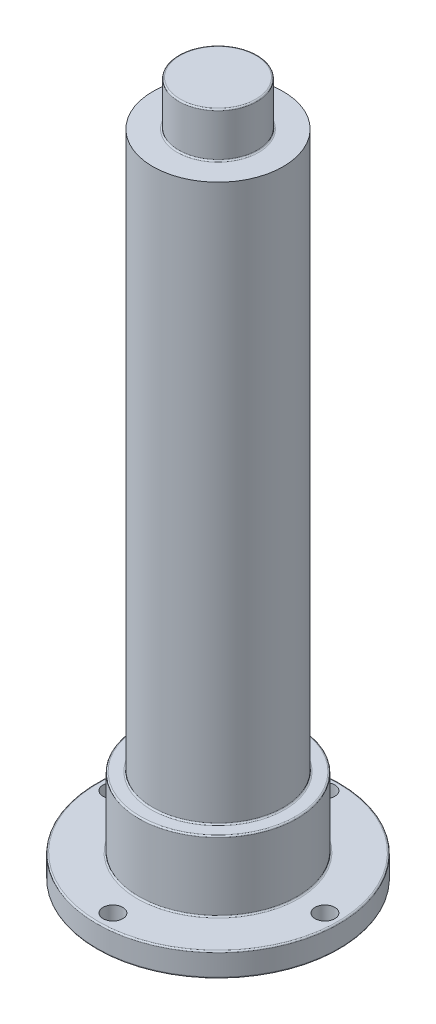
ISO-10303-21;
HEADER;
FILE_DESCRIPTION(('STEP AP214'),'2;1');
FILE_NAME('part.step','',(''),(''),'','','');
FILE_SCHEMA(('AUTOMOTIVE_DESIGN { 1 0 10303 214 1 1 1 1 }'));
ENDSEC;
DATA;
#1=APPLICATION_CONTEXT('core data for automotive mechanical design processes');
#2=APPLICATION_PROTOCOL_DEFINITION('international standard','automotive_design',2000,#1);
#3=PRODUCT_CONTEXT('',#1,'mechanical');
#4=PRODUCT('Part','Part','',(#3));
#5=PRODUCT_RELATED_PRODUCT_CATEGORY('part','',(#4));
#6=PRODUCT_DEFINITION_FORMATION('','',#4);
#7=PRODUCT_DEFINITION_CONTEXT('part definition',#1,'design');
#8=PRODUCT_DEFINITION('design','',#6,#7);
#9=PRODUCT_DEFINITION_SHAPE('','',#8);
#10=(LENGTH_UNIT() NAMED_UNIT(*) SI_UNIT(.MILLI.,.METRE.));
#11=(NAMED_UNIT(*) PLANE_ANGLE_UNIT() SI_UNIT($,.RADIAN.));
#12=(NAMED_UNIT(*) SI_UNIT($,.STERADIAN.) SOLID_ANGLE_UNIT());
#13=UNCERTAINTY_MEASURE_WITH_UNIT(LENGTH_MEASURE(1.E-05),#10,'distance_accuracy_value','');
#14=(GEOMETRIC_REPRESENTATION_CONTEXT(3) GLOBAL_UNCERTAINTY_ASSIGNED_CONTEXT((#13)) GLOBAL_UNIT_ASSIGNED_CONTEXT((#10,
#11,#12)) REPRESENTATION_CONTEXT('',''));
#15=CARTESIAN_POINT('',(0.,0.,0.));
#16=DIRECTION('',(0.,0.,1.));
#17=DIRECTION('',(1.,0.,0.));
#18=AXIS2_PLACEMENT_3D('',#15,#16,#17);
#19=CARTESIAN_POINT('',(0.,2.159,0.));
#20=DIRECTION('',(0.,-1.,0.));
#21=DIRECTION('',(0.,0.,-1.));
#22=AXIS2_PLACEMENT_3D('',#19,#20,#21);
#23=CYLINDRICAL_SURFACE('',#22,21.971);
#24=CARTESIAN_POINT('',(0.,1.905,0.));
#25=DIRECTION('',(0.,1.,0.));
#26=DIRECTION('',(0.,0.,1.));
#27=AXIS2_PLACEMENT_3D('',#24,#25,#26);
#28=CIRCLE('',#27,21.971);
#29=CARTESIAN_POINT('',(0.,1.905,21.971));
#30=VERTEX_POINT('',#29);
#31=EDGE_CURVE('E71',#30,#30,#28,.F.);
#32=ORIENTED_EDGE('',*,*,#31,.T.);
#33=EDGE_LOOP('',(#32));
#34=FACE_BOUND('',#33,.T.);
#35=CARTESIAN_POINT('',(0.,-1.905,0.));
#36=DIRECTION('',(0.,1.,0.));
#37=DIRECTION('',(0.,0.,1.));
#38=AXIS2_PLACEMENT_3D('',#35,#36,#37);
#39=CIRCLE('',#38,21.971);
#40=CARTESIAN_POINT('',(0.,-1.905,21.971));
#41=VERTEX_POINT('',#40);
#42=EDGE_CURVE('E80',#41,#41,#39,.T.);
#43=ORIENTED_EDGE('',*,*,#42,.T.);
#44=EDGE_LOOP('',(#43));
#45=FACE_BOUND('',#44,.T.);
#46=ADVANCED_FACE('F44',(#34,#45),#23,.T.);
#47=CARTESIAN_POINT('',(0.,2.159,0.));
#48=DIRECTION('',(0.,1.,0.));
#49=DIRECTION('',(0.,0.,1.));
#50=AXIS2_PLACEMENT_3D('',#47,#48,#49);
#51=PLANE('',#50);
#52=CARTESIAN_POINT('',(-19.2168521732445,2.15899999999999,-0.16685217324452));
#53=DIRECTION('',(0.,1.,0.));
#54=DIRECTION('',(0.,0.,1.));
#55=AXIS2_PLACEMENT_3D('',#52,#53,#54);
#56=CIRCLE('',#55,1.7907);
#57=CARTESIAN_POINT('',(-19.2168521732445,2.15899999999999,1.62384782675548));
#58=VERTEX_POINT('',#57);
#59=EDGE_CURVE('E108',#58,#58,#56,.T.);
#60=ORIENTED_EDGE('',*,*,#59,.F.);
#61=EDGE_LOOP('',(#60));
#62=FACE_BOUND('',#61,.T.);
#63=CARTESIAN_POINT('',(0.,2.15899999999999,-19.3837043464889));
#64=DIRECTION('',(0.,1.,0.));
#65=DIRECTION('',(0.,0.,1.));
#66=AXIS2_PLACEMENT_3D('',#63,#64,#65);
#67=CIRCLE('',#66,1.7907);
#68=CARTESIAN_POINT('',(0.,2.15899999999999,-17.5930043464889));
#69=VERTEX_POINT('',#68);
#70=EDGE_CURVE('E113',#69,#69,#67,.T.);
#71=ORIENTED_EDGE('',*,*,#70,.F.);
#72=EDGE_LOOP('',(#71));
#73=FACE_BOUND('',#72,.T.);
#74=CARTESIAN_POINT('',(19.2168521732445,2.15899999999999,-0.166852173244251));
#75=DIRECTION('',(0.,1.,0.));
#76=DIRECTION('',(0.,0.,1.));
#77=AXIS2_PLACEMENT_3D('',#74,#75,#76);
#78=CIRCLE('',#77,1.7907);
#79=CARTESIAN_POINT('',(19.2168521732445,2.15899999999999,1.62384782675575));
#80=VERTEX_POINT('',#79);
#81=EDGE_CURVE('E116',#80,#80,#78,.T.);
#82=ORIENTED_EDGE('',*,*,#81,.F.);
#83=EDGE_LOOP('',(#82));
#84=FACE_BOUND('',#83,.T.);
#85=CARTESIAN_POINT('',(0.,2.15899999999999,19.05));
#86=DIRECTION('',(0.,1.,0.));
#87=DIRECTION('',(0.,0.,1.));
#88=AXIS2_PLACEMENT_3D('',#85,#86,#87);
#89=CIRCLE('',#88,1.7907);
#90=CARTESIAN_POINT('',(0.,2.15899999999999,20.8407));
#91=VERTEX_POINT('',#90);
#92=EDGE_CURVE('E96',#91,#91,#89,.T.);
#93=ORIENTED_EDGE('',*,*,#92,.F.);
#94=EDGE_LOOP('',(#93));
#95=FACE_BOUND('',#94,.T.);
#96=CARTESIAN_POINT('',(0.,2.159,0.));
#97=DIRECTION('',(0.,1.,0.));
#98=DIRECTION('',(0.,0.,1.));
#99=AXIS2_PLACEMENT_3D('',#96,#97,#98);
#100=CIRCLE('',#99,21.717);
#101=CARTESIAN_POINT('',(0.,2.159,21.717));
#102=VERTEX_POINT('',#101);
#103=EDGE_CURVE('E78',#102,#102,#100,.T.);
#104=ORIENTED_EDGE('',*,*,#103,.T.);
#105=EDGE_LOOP('',(#104));
#106=FACE_BOUND('',#105,.T.);
#107=CARTESIAN_POINT('',(0.,2.159,0.));
#108=DIRECTION('',(0.,1.,0.));
#109=DIRECTION('',(0.,0.,1.));
#110=AXIS2_PLACEMENT_3D('',#107,#108,#109);
#111=CIRCLE('',#110,14.605);
#112=CARTESIAN_POINT('',(0.,2.159,14.605));
#113=VERTEX_POINT('',#112);
#114=EDGE_CURVE('E84',#113,#113,#111,.F.);
#115=ORIENTED_EDGE('',*,*,#114,.T.);
#116=EDGE_LOOP('',(#115));
#117=FACE_BOUND('',#116,.T.);
#118=ADVANCED_FACE('F168',(#62,#73,#84,#95,#106,#117),#51,.T.);
#119=CARTESIAN_POINT('',(0.,-2.159,0.));
#120=DIRECTION('',(0.,1.,0.));
#121=DIRECTION('',(0.,0.,1.));
#122=AXIS2_PLACEMENT_3D('',#119,#120,#121);
#123=PLANE('',#122);
#124=CARTESIAN_POINT('',(0.,-2.159,0.));
#125=DIRECTION('',(0.,-1.,0.));
#126=DIRECTION('',(0.,0.,-1.));
#127=AXIS2_PLACEMENT_3D('',#124,#125,#126);
#128=CIRCLE('',#127,1.7907);
#129=CARTESIAN_POINT('',(0.,-2.159,-1.7907));
#130=VERTEX_POINT('',#129);
#131=EDGE_CURVE('E150',#130,#130,#128,.T.);
#132=ORIENTED_EDGE('',*,*,#131,.F.);
#133=EDGE_LOOP('',(#132));
#134=FACE_BOUND('',#133,.T.);
#135=CARTESIAN_POINT('',(-6.12774113575067,-2.159,-0.0317411357506911));
#136=DIRECTION('',(0.,-1.,0.));
#137=DIRECTION('',(1.,0.,0.));
#138=AXIS2_PLACEMENT_3D('',#135,#136,#137);
#139=CIRCLE('',#138,1.651);
#140=CARTESIAN_POINT('',(-4.47674113575067,-2.159,-0.0317411357506853));
#141=VERTEX_POINT('',#140);
#142=EDGE_CURVE('E145',#141,#141,#139,.T.);
#143=ORIENTED_EDGE('',*,*,#142,.F.);
#144=EDGE_LOOP('',(#143));
#145=FACE_BOUND('',#144,.T.);
#146=CARTESIAN_POINT('',(0.,-2.159,-6.15948227150134));
#147=DIRECTION('',(0.,-1.,0.));
#148=DIRECTION('',(0.,0.,1.));
#149=AXIS2_PLACEMENT_3D('',#146,#147,#148);
#150=CIRCLE('',#149,1.651);
#151=CARTESIAN_POINT('',(0.,-2.159,-4.50848227150134));
#152=VERTEX_POINT('',#151);
#153=EDGE_CURVE('E137',#152,#152,#150,.T.);
#154=ORIENTED_EDGE('',*,*,#153,.F.);
#155=EDGE_LOOP('',(#154));
#156=FACE_BOUND('',#155,.T.);
#157=CARTESIAN_POINT('',(6.12774113575067,-2.159,-0.0317411357506055));
#158=DIRECTION('',(0.,-1.,0.));
#159=DIRECTION('',(-1.,0.,0.));
#160=AXIS2_PLACEMENT_3D('',#157,#158,#159);
#161=CIRCLE('',#160,1.651);
#162=CARTESIAN_POINT('',(4.47674113575067,-2.159,-0.0317411357506228));
#163=VERTEX_POINT('',#162);
#164=EDGE_CURVE('E126',#163,#163,#161,.T.);
#165=ORIENTED_EDGE('',*,*,#164,.F.);
#166=EDGE_LOOP('',(#165));
#167=FACE_BOUND('',#166,.T.);
#168=CARTESIAN_POINT('',(-19.2168521732445,-2.159,-0.16685217324452));
#169=DIRECTION('',(0.,-1.,0.));
#170=DIRECTION('',(1.,0.,0.));
#171=AXIS2_PLACEMENT_3D('',#168,#169,#170);
#172=CIRCLE('',#171,1.7907);
#173=CARTESIAN_POINT('',(-17.4261521732445,-2.159,-0.166852173244513));
#174=VERTEX_POINT('',#173);
#175=EDGE_CURVE('E118',#174,#174,#172,.T.);
#176=ORIENTED_EDGE('',*,*,#175,.F.);
#177=EDGE_LOOP('',(#176));
#178=FACE_BOUND('',#177,.T.);
#179=CARTESIAN_POINT('',(0.,-2.159,-19.3837043464889));
#180=DIRECTION('',(0.,-1.,0.));
#181=DIRECTION('',(0.,0.,1.));
#182=AXIS2_PLACEMENT_3D('',#179,#180,#181);
#183=CIRCLE('',#182,1.7907);
#184=CARTESIAN_POINT('',(0.,-2.159,-17.5930043464889));
#185=VERTEX_POINT('',#184);
#186=EDGE_CURVE('E124',#185,#185,#183,.T.);
#187=ORIENTED_EDGE('',*,*,#186,.F.);
#188=EDGE_LOOP('',(#187));
#189=FACE_BOUND('',#188,.T.);
#190=CARTESIAN_POINT('',(19.2168521732445,-2.159,-0.166852173244251));
#191=DIRECTION('',(0.,-1.,0.));
#192=DIRECTION('',(-1.,0.,0.));
#193=AXIS2_PLACEMENT_3D('',#190,#191,#192);
#194=CIRCLE('',#193,1.7907);
#195=CARTESIAN_POINT('',(17.4261521732445,-2.159,-0.16685217324427));
#196=VERTEX_POINT('',#195);
#197=EDGE_CURVE('E119',#196,#196,#194,.T.);
#198=ORIENTED_EDGE('',*,*,#197,.F.);
#199=EDGE_LOOP('',(#198));
#200=FACE_BOUND('',#199,.T.);
#201=CARTESIAN_POINT('',(0.,-2.159,6.096));
#202=DIRECTION('',(0.,-1.,0.));
#203=DIRECTION('',(0.,0.,-1.));
#204=AXIS2_PLACEMENT_3D('',#201,#202,#203);
#205=CIRCLE('',#204,1.651);
#206=CARTESIAN_POINT('',(0.,-2.159,4.445));
#207=VERTEX_POINT('',#206);
#208=EDGE_CURVE('E102',#207,#207,#205,.T.);
#209=ORIENTED_EDGE('',*,*,#208,.F.);
#210=EDGE_LOOP('',(#209));
#211=FACE_BOUND('',#210,.T.);
#212=CARTESIAN_POINT('',(0.,-2.159,19.05));
#213=DIRECTION('',(0.,-1.,0.));
#214=DIRECTION('',(0.,0.,-1.));
#215=AXIS2_PLACEMENT_3D('',#212,#213,#214);
#216=CIRCLE('',#215,1.7907);
#217=CARTESIAN_POINT('',(0.,-2.159,17.2593));
#218=VERTEX_POINT('',#217);
#219=EDGE_CURVE('E103',#218,#218,#216,.T.);
#220=ORIENTED_EDGE('',*,*,#219,.F.);
#221=EDGE_LOOP('',(#220));
#222=FACE_BOUND('',#221,.T.);
#223=CARTESIAN_POINT('',(0.,-2.159,0.));
#224=DIRECTION('',(0.,1.,0.));
#225=DIRECTION('',(0.,0.,1.));
#226=AXIS2_PLACEMENT_3D('',#223,#224,#225);
#227=CIRCLE('',#226,21.717);
#228=CARTESIAN_POINT('',(0.,-2.159,21.717));
#229=VERTEX_POINT('',#228);
#230=EDGE_CURVE('E10',#229,#229,#227,.F.);
#231=ORIENTED_EDGE('',*,*,#230,.T.);
#232=EDGE_LOOP('',(#231));
#233=FACE_BOUND('',#232,.T.);
#234=ADVANCED_FACE('F162',(#134,#145,#156,#167,#178,#189,#200,#211,#222,#233),#123,.F.);
#235=CARTESIAN_POINT('',(0.,14.859,0.));
#236=DIRECTION('',(0.,-1.,0.));
#237=DIRECTION('',(0.,0.,-1.));
#238=AXIS2_PLACEMENT_3D('',#235,#236,#237);
#239=CYLINDRICAL_SURFACE('',#238,14.351);
#240=CARTESIAN_POINT('',(0.,2.413,0.));
#241=DIRECTION('',(0.,1.,0.));
#242=DIRECTION('',(0.,0.,1.));
#243=AXIS2_PLACEMENT_3D('',#240,#241,#242);
#244=CIRCLE('',#243,14.351);
#245=CARTESIAN_POINT('',(0.,2.413,14.351));
#246=VERTEX_POINT('',#245);
#247=EDGE_CURVE('E70',#246,#246,#244,.T.);
#248=ORIENTED_EDGE('',*,*,#247,.T.);
#249=EDGE_LOOP('',(#248));
#250=FACE_BOUND('',#249,.T.);
#251=CARTESIAN_POINT('',(0.,14.605,0.));
#252=DIRECTION('',(0.,1.,0.));
#253=DIRECTION('',(0.,0.,1.));
#254=AXIS2_PLACEMENT_3D('',#251,#252,#253);
#255=CIRCLE('',#254,14.351);
#256=CARTESIAN_POINT('',(0.,14.605,14.351));
#257=VERTEX_POINT('',#256);
#258=EDGE_CURVE('E72',#257,#257,#255,.F.);
#259=ORIENTED_EDGE('',*,*,#258,.T.);
#260=EDGE_LOOP('',(#259));
#261=FACE_BOUND('',#260,.T.);
#262=ADVANCED_FACE('F164',(#250,#261),#239,.T.);
#263=CARTESIAN_POINT('',(0.,14.859,0.));
#264=DIRECTION('',(0.,1.,0.));
#265=DIRECTION('',(0.,0.,1.));
#266=AXIS2_PLACEMENT_3D('',#263,#264,#265);
#267=PLANE('',#266);
#268=CARTESIAN_POINT('',(0.,14.859,0.));
#269=DIRECTION('',(0.,1.,0.));
#270=DIRECTION('',(0.,0.,1.));
#271=AXIS2_PLACEMENT_3D('',#268,#269,#270);
#272=CIRCLE('',#271,12.065);
#273=CARTESIAN_POINT('',(0.,14.859,12.065));
#274=VERTEX_POINT('',#273);
#275=EDGE_CURVE('E89',#274,#274,#272,.F.);
#276=ORIENTED_EDGE('',*,*,#275,.T.);
#277=EDGE_LOOP('',(#276));
#278=FACE_BOUND('',#277,.T.);
#279=CARTESIAN_POINT('',(0.,14.859,0.));
#280=DIRECTION('',(0.,1.,0.));
#281=DIRECTION('',(0.,0.,1.));
#282=AXIS2_PLACEMENT_3D('',#279,#280,#281);
#283=CIRCLE('',#282,14.097);
#284=CARTESIAN_POINT('',(0.,14.859,14.097));
#285=VERTEX_POINT('',#284);
#286=EDGE_CURVE('E88',#285,#285,#283,.T.);
#287=ORIENTED_EDGE('',*,*,#286,.T.);
#288=EDGE_LOOP('',(#287));
#289=FACE_BOUND('',#288,.T.);
#290=ADVANCED_FACE('F255',(#278,#289),#267,.T.);
#291=CARTESIAN_POINT('',(0.,115.697,0.));
#292=DIRECTION('',(0.,-1.,0.));
#293=DIRECTION('',(0.,0.,-1.));
#294=AXIS2_PLACEMENT_3D('',#291,#292,#293);
#295=CYLINDRICAL_SURFACE('',#294,11.811);
#296=CARTESIAN_POINT('',(0.,15.113,0.));
#297=DIRECTION('',(0.,1.,0.));
#298=DIRECTION('',(0.,0.,1.));
#299=AXIS2_PLACEMENT_3D('',#296,#297,#298);
#300=CIRCLE('',#299,11.811);
#301=CARTESIAN_POINT('',(0.,15.113,11.811));
#302=VERTEX_POINT('',#301);
#303=EDGE_CURVE('E95',#302,#302,#300,.T.);
#304=ORIENTED_EDGE('',*,*,#303,.T.);
#305=EDGE_LOOP('',(#304));
#306=FACE_BOUND('',#305,.T.);
#307=CARTESIAN_POINT('',(0.,115.697,0.));
#308=DIRECTION('',(0.,1.,0.));
#309=DIRECTION('',(0.,0.,1.));
#310=AXIS2_PLACEMENT_3D('',#307,#308,#309);
#311=CIRCLE('',#310,11.811);
#312=CARTESIAN_POINT('',(0.,115.697,11.811));
#313=VERTEX_POINT('',#312);
#314=EDGE_CURVE('E93',#313,#313,#311,.T.);
#315=ORIENTED_EDGE('',*,*,#314,.F.);
#316=EDGE_LOOP('',(#315));
#317=FACE_BOUND('',#316,.T.);
#318=ADVANCED_FACE('F250',(#306,#317),#295,.T.);
#319=CARTESIAN_POINT('',(0.,115.697,0.));
#320=DIRECTION('',(0.,1.,0.));
#321=DIRECTION('',(0.,0.,1.));
#322=AXIS2_PLACEMENT_3D('',#319,#320,#321);
#323=PLANE('',#322);
#324=CARTESIAN_POINT('',(0.,115.697,0.));
#325=DIRECTION('',(0.,1.,0.));
#326=DIRECTION('',(0.,0.,1.));
#327=AXIS2_PLACEMENT_3D('',#324,#325,#326);
#328=CIRCLE('',#327,7.366);
#329=CARTESIAN_POINT('',(0.,115.697,7.366));
#330=VERTEX_POINT('',#329);
#331=EDGE_CURVE('E55',#330,#330,#328,.F.);
#332=ORIENTED_EDGE('',*,*,#331,.T.);
#333=EDGE_LOOP('',(#332));
#334=FACE_BOUND('',#333,.T.);
#335=ORIENTED_EDGE('',*,*,#314,.T.);
#336=EDGE_LOOP('',(#335));
#337=FACE_BOUND('',#336,.T.);
#338=ADVANCED_FACE('F237',(#334,#337),#323,.T.);
#339=CARTESIAN_POINT('',(0.,123.825,0.));
#340=DIRECTION('',(0.,-1.,0.));
#341=DIRECTION('',(0.,0.,-1.));
#342=AXIS2_PLACEMENT_3D('',#339,#340,#341);
#343=CYLINDRICAL_SURFACE('',#342,7.112);
#344=CARTESIAN_POINT('',(0.,123.571,0.));
#345=DIRECTION('',(0.,1.,0.));
#346=DIRECTION('',(0.,0.,1.));
#347=AXIS2_PLACEMENT_3D('',#344,#345,#346);
#348=CIRCLE('',#347,7.112);
#349=CARTESIAN_POINT('',(0.,123.571,7.112));
#350=VERTEX_POINT('',#349);
#351=EDGE_CURVE('E57',#350,#350,#348,.F.);
#352=ORIENTED_EDGE('',*,*,#351,.T.);
#353=EDGE_LOOP('',(#352));
#354=FACE_BOUND('',#353,.T.);
#355=CARTESIAN_POINT('',(0.,115.951,0.));
#356=DIRECTION('',(0.,1.,0.));
#357=DIRECTION('',(0.,0.,1.));
#358=AXIS2_PLACEMENT_3D('',#355,#356,#357);
#359=CIRCLE('',#358,7.112);
#360=CARTESIAN_POINT('',(0.,115.951,7.112));
#361=VERTEX_POINT('',#360);
#362=EDGE_CURVE('E58',#361,#361,#359,.T.);
#363=ORIENTED_EDGE('',*,*,#362,.T.);
#364=EDGE_LOOP('',(#363));
#365=FACE_BOUND('',#364,.T.);
#366=ADVANCED_FACE('F240',(#354,#365),#343,.T.);
#367=CARTESIAN_POINT('',(0.,123.825,0.));
#368=DIRECTION('',(0.,1.,0.));
#369=DIRECTION('',(0.,0.,1.));
#370=AXIS2_PLACEMENT_3D('',#367,#368,#369);
#371=PLANE('',#370);
#372=CARTESIAN_POINT('',(0.,123.825,0.));
#373=DIRECTION('',(0.,1.,0.));
#374=DIRECTION('',(0.,0.,1.));
#375=AXIS2_PLACEMENT_3D('',#372,#373,#374);
#376=CIRCLE('',#375,6.858);
#377=CARTESIAN_POINT('',(0.,123.825,6.858));
#378=VERTEX_POINT('',#377);
#379=EDGE_CURVE('E63',#378,#378,#376,.T.);
#380=ORIENTED_EDGE('',*,*,#379,.T.);
#381=EDGE_LOOP('',(#380));
#382=FACE_BOUND('',#381,.T.);
#383=ADVANCED_FACE('F211',(#382),#371,.T.);
#384=CARTESIAN_POINT('',(0.,15.113,0.));
#385=DIRECTION('',(0.,1.,0.));
#386=DIRECTION('',(0.,0.,1.));
#387=AXIS2_PLACEMENT_3D('',#384,#385,#386);
#388=TOROIDAL_SURFACE('',#387,12.065,0.254);
#389=ORIENTED_EDGE('',*,*,#275,.F.);
#390=EDGE_LOOP('',(#389));
#391=FACE_BOUND('',#390,.T.);
#392=ORIENTED_EDGE('',*,*,#303,.F.);
#393=EDGE_LOOP('',(#392));
#394=FACE_BOUND('',#393,.T.);
#395=ADVANCED_FACE('F208',(#391,#394),#388,.F.);
#396=CARTESIAN_POINT('',(0.,1.905,0.));
#397=DIRECTION('',(0.,1.,0.));
#398=DIRECTION('',(0.,0.,1.));
#399=AXIS2_PLACEMENT_3D('',#396,#397,#398);
#400=TOROIDAL_SURFACE('',#399,21.717,0.254);
#401=ORIENTED_EDGE('',*,*,#31,.F.);
#402=EDGE_LOOP('',(#401));
#403=FACE_BOUND('',#402,.T.);
#404=ORIENTED_EDGE('',*,*,#103,.F.);
#405=EDGE_LOOP('',(#404));
#406=FACE_BOUND('',#405,.T.);
#407=ADVANCED_FACE('F214',(#403,#406),#400,.T.);
#408=CARTESIAN_POINT('',(0.,2.413,0.));
#409=DIRECTION('',(0.,1.,0.));
#410=DIRECTION('',(0.,0.,1.));
#411=AXIS2_PLACEMENT_3D('',#408,#409,#410);
#412=TOROIDAL_SURFACE('',#411,14.605,0.254);
#413=ORIENTED_EDGE('',*,*,#114,.F.);
#414=EDGE_LOOP('',(#413));
#415=FACE_BOUND('',#414,.T.);
#416=ORIENTED_EDGE('',*,*,#247,.F.);
#417=EDGE_LOOP('',(#416));
#418=FACE_BOUND('',#417,.T.);
#419=ADVANCED_FACE('F220',(#415,#418),#412,.F.);
#420=CARTESIAN_POINT('',(0.,14.605,0.));
#421=DIRECTION('',(0.,1.,0.));
#422=DIRECTION('',(0.,0.,1.));
#423=AXIS2_PLACEMENT_3D('',#420,#421,#422);
#424=TOROIDAL_SURFACE('',#423,14.097,0.254);
#425=ORIENTED_EDGE('',*,*,#258,.F.);
#426=EDGE_LOOP('',(#425));
#427=FACE_BOUND('',#426,.T.);
#428=ORIENTED_EDGE('',*,*,#286,.F.);
#429=EDGE_LOOP('',(#428));
#430=FACE_BOUND('',#429,.T.);
#431=ADVANCED_FACE('F225',(#427,#430),#424,.T.);
#432=CARTESIAN_POINT('',(0.,123.571,0.));
#433=DIRECTION('',(0.,1.,0.));
#434=DIRECTION('',(0.,0.,1.));
#435=AXIS2_PLACEMENT_3D('',#432,#433,#434);
#436=TOROIDAL_SURFACE('',#435,6.858,0.254);
#437=ORIENTED_EDGE('',*,*,#351,.F.);
#438=EDGE_LOOP('',(#437));
#439=FACE_BOUND('',#438,.T.);
#440=ORIENTED_EDGE('',*,*,#379,.F.);
#441=EDGE_LOOP('',(#440));
#442=FACE_BOUND('',#441,.T.);
#443=ADVANCED_FACE('F228',(#439,#442),#436,.T.);
#444=CARTESIAN_POINT('',(0.,115.951,0.));
#445=DIRECTION('',(0.,1.,0.));
#446=DIRECTION('',(0.,0.,1.));
#447=AXIS2_PLACEMENT_3D('',#444,#445,#446);
#448=TOROIDAL_SURFACE('',#447,7.366,0.254);
#449=ORIENTED_EDGE('',*,*,#331,.F.);
#450=EDGE_LOOP('',(#449));
#451=FACE_BOUND('',#450,.T.);
#452=ORIENTED_EDGE('',*,*,#362,.F.);
#453=EDGE_LOOP('',(#452));
#454=FACE_BOUND('',#453,.T.);
#455=ADVANCED_FACE('F199',(#451,#454),#448,.F.);
#456=CARTESIAN_POINT('',(0.,-1.905,0.));
#457=DIRECTION('',(0.,1.,0.));
#458=DIRECTION('',(0.,0.,1.));
#459=AXIS2_PLACEMENT_3D('',#456,#457,#458);
#460=TOROIDAL_SURFACE('',#459,21.717,0.254);
#461=ORIENTED_EDGE('',*,*,#230,.F.);
#462=EDGE_LOOP('',(#461));
#463=FACE_BOUND('',#462,.T.);
#464=ORIENTED_EDGE('',*,*,#42,.F.);
#465=EDGE_LOOP('',(#464));
#466=FACE_BOUND('',#465,.T.);
#467=ADVANCED_FACE('F50',(#463,#466),#460,.T.);
#468=CARTESIAN_POINT('',(0.,123.825,19.05));
#469=DIRECTION('',(0.,-1.,0.));
#470=DIRECTION('',(0.,0.,-1.));
#471=AXIS2_PLACEMENT_3D('',#468,#469,#470);
#472=CYLINDRICAL_SURFACE('',#471,1.7907);
#473=ORIENTED_EDGE('',*,*,#92,.T.);
#474=EDGE_LOOP('',(#473));
#475=FACE_BOUND('',#474,.T.);
#476=ORIENTED_EDGE('',*,*,#219,.T.);
#477=EDGE_LOOP('',(#476));
#478=FACE_BOUND('',#477,.T.);
#479=ADVANCED_FACE('F183',(#475,#478),#472,.F.);
#480=CARTESIAN_POINT('',(0.,15.621,6.096));
#481=DIRECTION('',(0.,-1.,0.));
#482=DIRECTION('',(0.,0.,-1.));
#483=AXIS2_PLACEMENT_3D('',#480,#481,#482);
#484=CYLINDRICAL_SURFACE('',#483,1.651);
#485=CARTESIAN_POINT('',(0.,15.621,6.096));
#486=DIRECTION('',(0.,-1.,0.));
#487=DIRECTION('',(0.,0.,-1.));
#488=AXIS2_PLACEMENT_3D('',#485,#486,#487);
#489=CIRCLE('',#488,1.651);
#490=CARTESIAN_POINT('',(0.,15.621,4.445));
#491=VERTEX_POINT('',#490);
#492=EDGE_CURVE('E104',#491,#491,#489,.T.);
#493=ORIENTED_EDGE('',*,*,#492,.F.);
#494=EDGE_LOOP('',(#493));
#495=FACE_BOUND('',#494,.T.);
#496=ORIENTED_EDGE('',*,*,#208,.T.);
#497=EDGE_LOOP('',(#496));
#498=FACE_BOUND('',#497,.T.);
#499=ADVANCED_FACE('F187',(#495,#498),#484,.F.);
#500=CARTESIAN_POINT('',(0.,15.621,6.096));
#501=DIRECTION('',(0.,-1.,0.));
#502=DIRECTION('',(0.,0.,-1.));
#503=AXIS2_PLACEMENT_3D('',#500,#501,#502);
#504=PLANE('',#503);
#505=ORIENTED_EDGE('',*,*,#492,.T.);
#506=EDGE_LOOP('',(#505));
#507=FACE_BOUND('',#506,.T.);
#508=ADVANCED_FACE('F194',(#507),#504,.T.);
#509=CARTESIAN_POINT('',(19.2168521732445,123.825,-0.166852173244251));
#510=DIRECTION('',(0.,-1.,0.));
#511=DIRECTION('',(0.,0.,-1.));
#512=AXIS2_PLACEMENT_3D('',#509,#510,#511);
#513=CYLINDRICAL_SURFACE('',#512,1.7907);
#514=ORIENTED_EDGE('',*,*,#81,.T.);
#515=EDGE_LOOP('',(#514));
#516=FACE_BOUND('',#515,.T.);
#517=ORIENTED_EDGE('',*,*,#197,.T.);
#518=EDGE_LOOP('',(#517));
#519=FACE_BOUND('',#518,.T.);
#520=ADVANCED_FACE('F354',(#516,#519),#513,.F.);
#521=CARTESIAN_POINT('',(0.,123.825,-19.3837043464889));
#522=DIRECTION('',(0.,-1.,0.));
#523=DIRECTION('',(0.,0.,-1.));
#524=AXIS2_PLACEMENT_3D('',#521,#522,#523);
#525=CYLINDRICAL_SURFACE('',#524,1.7907);
#526=ORIENTED_EDGE('',*,*,#70,.T.);
#527=EDGE_LOOP('',(#526));
#528=FACE_BOUND('',#527,.T.);
#529=ORIENTED_EDGE('',*,*,#186,.T.);
#530=EDGE_LOOP('',(#529));
#531=FACE_BOUND('',#530,.T.);
#532=ADVANCED_FACE('F361',(#528,#531),#525,.F.);
#533=CARTESIAN_POINT('',(-19.2168521732445,123.825,-0.16685217324452));
#534=DIRECTION('',(0.,-1.,0.));
#535=DIRECTION('',(0.,0.,-1.));
#536=AXIS2_PLACEMENT_3D('',#533,#534,#535);
#537=CYLINDRICAL_SURFACE('',#536,1.7907);
#538=ORIENTED_EDGE('',*,*,#59,.T.);
#539=EDGE_LOOP('',(#538));
#540=FACE_BOUND('',#539,.T.);
#541=ORIENTED_EDGE('',*,*,#175,.T.);
#542=EDGE_LOOP('',(#541));
#543=FACE_BOUND('',#542,.T.);
#544=ADVANCED_FACE('F373',(#540,#543),#537,.F.);
#545=CARTESIAN_POINT('',(6.12774113575067,15.621,-0.0317411357506055));
#546=DIRECTION('',(0.,-1.,0.));
#547=DIRECTION('',(0.,0.,-1.));
#548=AXIS2_PLACEMENT_3D('',#545,#546,#547);
#549=CYLINDRICAL_SURFACE('',#548,1.651);
#550=CARTESIAN_POINT('',(6.12774113575067,15.621,-0.0317411357506055));
#551=DIRECTION('',(0.,-1.,0.));
#552=DIRECTION('',(-1.,0.,0.));
#553=AXIS2_PLACEMENT_3D('',#550,#551,#552);
#554=CIRCLE('',#553,1.651);
#555=CARTESIAN_POINT('',(4.47674113575067,15.621,-0.0317411357506228));
#556=VERTEX_POINT('',#555);
#557=EDGE_CURVE('E131',#556,#556,#554,.T.);
#558=ORIENTED_EDGE('',*,*,#557,.F.);
#559=EDGE_LOOP('',(#558));
#560=FACE_BOUND('',#559,.T.);
#561=ORIENTED_EDGE('',*,*,#164,.T.);
#562=EDGE_LOOP('',(#561));
#563=FACE_BOUND('',#562,.T.);
#564=ADVANCED_FACE('F384',(#560,#563),#549,.F.);
#565=CARTESIAN_POINT('',(6.12774113575067,15.621,-0.0317411357506055));
#566=DIRECTION('',(0.,-1.,0.));
#567=DIRECTION('',(-1.,0.,0.));
#568=AXIS2_PLACEMENT_3D('',#565,#566,#567);
#569=PLANE('',#568);
#570=ORIENTED_EDGE('',*,*,#557,.T.);
#571=EDGE_LOOP('',(#570));
#572=FACE_BOUND('',#571,.T.);
#573=ADVANCED_FACE('F395',(#572),#569,.T.);
#574=CARTESIAN_POINT('',(0.,15.621,-6.15948227150134));
#575=DIRECTION('',(0.,-1.,0.));
#576=DIRECTION('',(0.,0.,-1.));
#577=AXIS2_PLACEMENT_3D('',#574,#575,#576);
#578=CYLINDRICAL_SURFACE('',#577,1.651);
#579=CARTESIAN_POINT('',(0.,15.621,-6.15948227150134));
#580=DIRECTION('',(0.,-1.,0.));
#581=DIRECTION('',(0.,0.,1.));
#582=AXIS2_PLACEMENT_3D('',#579,#580,#581);
#583=CIRCLE('',#582,1.651);
#584=CARTESIAN_POINT('',(0.,15.621,-4.50848227150134));
#585=VERTEX_POINT('',#584);
#586=EDGE_CURVE('E136',#585,#585,#583,.T.);
#587=ORIENTED_EDGE('',*,*,#586,.F.);
#588=EDGE_LOOP('',(#587));
#589=FACE_BOUND('',#588,.T.);
#590=ORIENTED_EDGE('',*,*,#153,.T.);
#591=EDGE_LOOP('',(#590));
#592=FACE_BOUND('',#591,.T.);
#593=ADVANCED_FACE('F401',(#589,#592),#578,.F.);
#594=CARTESIAN_POINT('',(0.,15.621,-6.15948227150134));
#595=DIRECTION('',(0.,-1.,0.));
#596=DIRECTION('',(0.,0.,1.));
#597=AXIS2_PLACEMENT_3D('',#594,#595,#596);
#598=PLANE('',#597);
#599=ORIENTED_EDGE('',*,*,#586,.T.);
#600=EDGE_LOOP('',(#599));
#601=FACE_BOUND('',#600,.T.);
#602=ADVANCED_FACE('F415',(#601),#598,.T.);
#603=CARTESIAN_POINT('',(-6.12774113575067,15.621,-0.0317411357506911));
#604=DIRECTION('',(0.,-1.,0.));
#605=DIRECTION('',(0.,0.,-1.));
#606=AXIS2_PLACEMENT_3D('',#603,#604,#605);
#607=CYLINDRICAL_SURFACE('',#606,1.651);
#608=CARTESIAN_POINT('',(-6.12774113575067,15.621,-0.0317411357506911));
#609=DIRECTION('',(0.,-1.,0.));
#610=DIRECTION('',(1.,0.,0.));
#611=AXIS2_PLACEMENT_3D('',#608,#609,#610);
#612=CIRCLE('',#611,1.651);
#613=CARTESIAN_POINT('',(-4.47674113575067,15.621,-0.0317411357506853));
#614=VERTEX_POINT('',#613);
#615=EDGE_CURVE('E121',#614,#614,#612,.T.);
#616=ORIENTED_EDGE('',*,*,#615,.F.);
#617=EDGE_LOOP('',(#616));
#618=FACE_BOUND('',#617,.T.);
#619=ORIENTED_EDGE('',*,*,#142,.T.);
#620=EDGE_LOOP('',(#619));
#621=FACE_BOUND('',#620,.T.);
#622=ADVANCED_FACE('F421',(#618,#621),#607,.F.);
#623=CARTESIAN_POINT('',(-6.12774113575067,15.621,-0.0317411357506911));
#624=DIRECTION('',(0.,-1.,0.));
#625=DIRECTION('',(1.,0.,0.));
#626=AXIS2_PLACEMENT_3D('',#623,#624,#625);
#627=PLANE('',#626);
#628=ORIENTED_EDGE('',*,*,#615,.T.);
#629=EDGE_LOOP('',(#628));
#630=FACE_BOUND('',#629,.T.);
#631=ADVANCED_FACE('F159',(#630),#627,.T.);
#632=CARTESIAN_POINT('',(0.,15.621,0.));
#633=DIRECTION('',(0.,-1.,0.));
#634=DIRECTION('',(0.,0.,-1.));
#635=AXIS2_PLACEMENT_3D('',#632,#633,#634);
#636=CYLINDRICAL_SURFACE('',#635,1.7907);
#637=CARTESIAN_POINT('',(0.,15.621,0.));
#638=DIRECTION('',(0.,-1.,0.));
#639=DIRECTION('',(0.,0.,-1.));
#640=AXIS2_PLACEMENT_3D('',#637,#638,#639);
#641=CIRCLE('',#640,1.7907);
#642=CARTESIAN_POINT('',(0.,15.621,-1.7907));
#643=VERTEX_POINT('',#642);
#644=EDGE_CURVE('E135',#643,#643,#641,.T.);
#645=ORIENTED_EDGE('',*,*,#644,.F.);
#646=EDGE_LOOP('',(#645));
#647=FACE_BOUND('',#646,.T.);
#648=ORIENTED_EDGE('',*,*,#131,.T.);
#649=EDGE_LOOP('',(#648));
#650=FACE_BOUND('',#649,.T.);
#651=ADVANCED_FACE('F152',(#647,#650),#636,.F.);
#652=CARTESIAN_POINT('',(0.,15.621,0.));
#653=DIRECTION('',(0.,-1.,0.));
#654=DIRECTION('',(0.,0.,-1.));
#655=AXIS2_PLACEMENT_3D('',#652,#653,#654);
#656=PLANE('',#655);
#657=ORIENTED_EDGE('',*,*,#644,.T.);
#658=EDGE_LOOP('',(#657));
#659=FACE_BOUND('',#658,.T.);
#660=ADVANCED_FACE('F155',(#659),#656,.T.);
#661=CLOSED_SHELL('',(#46,#118,#234,#262,#290,#318,#338,#366,#383,#395,#407,#419,#431,#443,#455,
#467,#479,#499,#508,#520,#532,#544,#564,#573,#593,#602,#622,#631,#651,#660));
#662=MANIFOLD_SOLID_BREP('B2',#661);
#663=ADVANCED_BREP_SHAPE_REPRESENTATION('',(#18,#662),#14);
#664=SHAPE_DEFINITION_REPRESENTATION(#9,#663);
ENDSEC;
END-ISO-10303-21;
